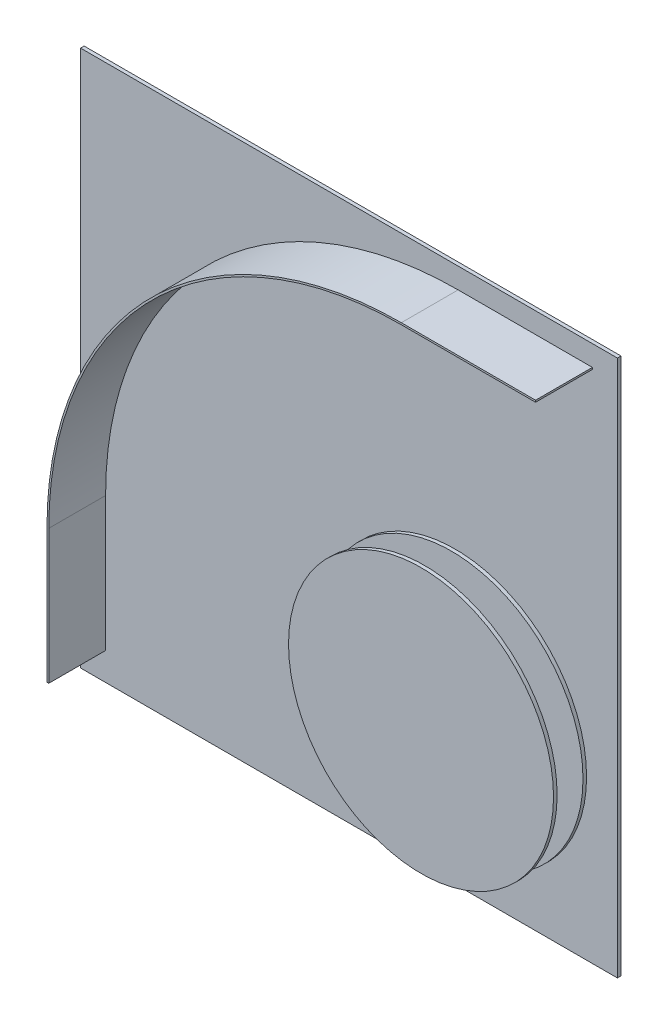
ISO-10303-21;
HEADER;
FILE_DESCRIPTION(('STEP AP214'),'2;1');
FILE_NAME('part.step','',(''),(''),'','','');
FILE_SCHEMA(('AUTOMOTIVE_DESIGN { 1 0 10303 214 1 1 1 1 }'));
ENDSEC;
DATA;
#1=APPLICATION_CONTEXT('core data for automotive mechanical design processes');
#2=APPLICATION_PROTOCOL_DEFINITION('international standard','automotive_design',2000,#1);
#3=PRODUCT_CONTEXT('',#1,'mechanical');
#4=PRODUCT('Part','Part','',(#3));
#5=PRODUCT_RELATED_PRODUCT_CATEGORY('part','',(#4));
#6=PRODUCT_DEFINITION_FORMATION('','',#4);
#7=PRODUCT_DEFINITION_CONTEXT('part definition',#1,'design');
#8=PRODUCT_DEFINITION('design','',#6,#7);
#9=PRODUCT_DEFINITION_SHAPE('','',#8);
#10=(LENGTH_UNIT() NAMED_UNIT(*) SI_UNIT(.MILLI.,.METRE.));
#11=(NAMED_UNIT(*) PLANE_ANGLE_UNIT() SI_UNIT($,.RADIAN.));
#12=(NAMED_UNIT(*) SI_UNIT($,.STERADIAN.) SOLID_ANGLE_UNIT());
#13=UNCERTAINTY_MEASURE_WITH_UNIT(LENGTH_MEASURE(1.E-05),#10,'distance_accuracy_value','');
#14=(GEOMETRIC_REPRESENTATION_CONTEXT(3) GLOBAL_UNCERTAINTY_ASSIGNED_CONTEXT((#13)) GLOBAL_UNIT_ASSIGNED_CONTEXT((#10,
#11,#12)) REPRESENTATION_CONTEXT('',''));
#15=CARTESIAN_POINT('',(0.,0.,0.));
#16=DIRECTION('',(0.,0.,1.));
#17=DIRECTION('',(1.,0.,0.));
#18=AXIS2_PLACEMENT_3D('',#15,#16,#17);
#19=CARTESIAN_POINT('',(-422.012002147075,419.033794954374,-7.5));
#20=DIRECTION('',(-1.,0.,0.));
#21=DIRECTION('',(0.,-1.,0.));
#22=AXIS2_PLACEMENT_3D('',#19,#20,#21);
#23=PLANE('',#22);
#24=DIRECTION('',(0.,-1.,0.));
#25=VECTOR('',#24,1.);
#26=CARTESIAN_POINT('',(-422.012002147075,419.033794954374,-3.5));
#27=LINE('',#26,#25);
#28=CARTESIAN_POINT('',(-422.012002147075,419.033794954374,-3.5));
#29=VERTEX_POINT('',#28);
#30=CARTESIAN_POINT('',(-422.012002147075,-180.966205045625,-3.5));
#31=VERTEX_POINT('',#30);
#32=EDGE_CURVE('E116',#29,#31,#27,.T.);
#33=ORIENTED_EDGE('',*,*,#32,.F.);
#34=DIRECTION('',(0.,0.,1.));
#35=VECTOR('',#34,1.);
#36=CARTESIAN_POINT('',(-422.012002147075,419.033794954374,-7.5));
#37=LINE('',#36,#35);
#38=CARTESIAN_POINT('',(-422.012002147075,419.033794954374,-7.5));
#39=VERTEX_POINT('',#38);
#40=EDGE_CURVE('E12',#39,#29,#37,.T.);
#41=ORIENTED_EDGE('',*,*,#40,.F.);
#42=DIRECTION('',(0.,-1.,0.));
#43=VECTOR('',#42,1.);
#44=CARTESIAN_POINT('',(-422.012002147075,419.033794954374,-7.5));
#45=LINE('',#44,#43);
#46=CARTESIAN_POINT('',(-422.012002147075,-180.966205045625,-7.5));
#47=VERTEX_POINT('',#46);
#48=EDGE_CURVE('E110',#39,#47,#45,.T.);
#49=ORIENTED_EDGE('',*,*,#48,.T.);
#50=DIRECTION('',(0.,0.,1.));
#51=VECTOR('',#50,1.);
#52=CARTESIAN_POINT('',(-422.012002147075,-180.966205045625,-7.5));
#53=LINE('',#52,#51);
#54=EDGE_CURVE('E55',#47,#31,#53,.T.);
#55=ORIENTED_EDGE('',*,*,#54,.T.);
#56=EDGE_LOOP('',(#33,#41,#49,#55));
#57=FACE_BOUND('',#56,.T.);
#58=ADVANCED_FACE('F52',(#57),#23,.T.);
#59=CARTESIAN_POINT('',(-422.012002147075,419.033794954374,-7.5));
#60=DIRECTION('',(0.,1.,0.));
#61=DIRECTION('',(0.,0.,1.));
#62=AXIS2_PLACEMENT_3D('',#59,#60,#61);
#63=PLANE('',#62);
#64=DIRECTION('',(-1.,0.,0.));
#65=VECTOR('',#64,1.);
#66=CARTESIAN_POINT('',(-422.012002147075,419.033794954374,-3.5));
#67=LINE('',#66,#65);
#68=CARTESIAN_POINT('',(177.987997852925,419.033794954374,-3.5));
#69=VERTEX_POINT('',#68);
#70=EDGE_CURVE('E112',#69,#29,#67,.T.);
#71=ORIENTED_EDGE('',*,*,#70,.F.);
#72=DIRECTION('',(0.,0.,1.));
#73=VECTOR('',#72,1.);
#74=CARTESIAN_POINT('',(177.987997852925,419.033794954374,-7.5));
#75=LINE('',#74,#73);
#76=CARTESIAN_POINT('',(177.987997852925,419.033794954374,-7.5));
#77=VERTEX_POINT('',#76);
#78=EDGE_CURVE('E61',#77,#69,#75,.T.);
#79=ORIENTED_EDGE('',*,*,#78,.F.);
#80=DIRECTION('',(-1.,0.,0.));
#81=VECTOR('',#80,1.);
#82=CARTESIAN_POINT('',(-422.012002147075,419.033794954374,-7.5));
#83=LINE('',#82,#81);
#84=EDGE_CURVE('E107',#77,#39,#83,.T.);
#85=ORIENTED_EDGE('',*,*,#84,.T.);
#86=ORIENTED_EDGE('',*,*,#40,.T.);
#87=EDGE_LOOP('',(#71,#79,#85,#86));
#88=FACE_BOUND('',#87,.T.);
#89=ADVANCED_FACE('F126',(#88),#63,.T.);
#90=CARTESIAN_POINT('',(177.987997852925,419.033794954374,-7.5));
#91=DIRECTION('',(1.,0.,0.));
#92=DIRECTION('',(0.,1.,0.));
#93=AXIS2_PLACEMENT_3D('',#90,#91,#92);
#94=PLANE('',#93);
#95=DIRECTION('',(0.,1.,0.));
#96=VECTOR('',#95,1.);
#97=CARTESIAN_POINT('',(177.987997852925,419.033794954374,-3.5));
#98=LINE('',#97,#96);
#99=CARTESIAN_POINT('',(177.987997852925,-180.966205045625,-3.5));
#100=VERTEX_POINT('',#99);
#101=EDGE_CURVE('E102',#100,#69,#98,.T.);
#102=ORIENTED_EDGE('',*,*,#101,.F.);
#103=DIRECTION('',(0.,0.,1.));
#104=VECTOR('',#103,1.);
#105=CARTESIAN_POINT('',(177.987997852925,-180.966205045625,-7.5));
#106=LINE('',#105,#104);
#107=CARTESIAN_POINT('',(177.987997852925,-180.966205045625,-7.5));
#108=VERTEX_POINT('',#107);
#109=EDGE_CURVE('E97',#108,#100,#106,.T.);
#110=ORIENTED_EDGE('',*,*,#109,.F.);
#111=DIRECTION('',(0.,1.,0.));
#112=VECTOR('',#111,1.);
#113=CARTESIAN_POINT('',(177.987997852925,419.033794954374,-7.5));
#114=LINE('',#113,#112);
#115=EDGE_CURVE('E100',#108,#77,#114,.T.);
#116=ORIENTED_EDGE('',*,*,#115,.T.);
#117=ORIENTED_EDGE('',*,*,#78,.T.);
#118=EDGE_LOOP('',(#102,#110,#116,#117));
#119=FACE_BOUND('',#118,.T.);
#120=ADVANCED_FACE('F99',(#119),#94,.T.);
#121=CARTESIAN_POINT('',(-422.012002147075,-180.966205045625,-7.5));
#122=DIRECTION('',(0.,-1.,0.));
#123=DIRECTION('',(0.,0.,-1.));
#124=AXIS2_PLACEMENT_3D('',#121,#122,#123);
#125=PLANE('',#124);
#126=DIRECTION('',(1.,0.,0.));
#127=VECTOR('',#126,1.);
#128=CARTESIAN_POINT('',(-422.012002147075,-180.966205045625,-3.5));
#129=LINE('',#128,#127);
#130=EDGE_CURVE('E119',#31,#100,#129,.T.);
#131=ORIENTED_EDGE('',*,*,#130,.F.);
#132=ORIENTED_EDGE('',*,*,#54,.F.);
#133=DIRECTION('',(1.,0.,0.));
#134=VECTOR('',#133,1.);
#135=CARTESIAN_POINT('',(-422.012002147075,-180.966205045625,-7.5));
#136=LINE('',#135,#134);
#137=EDGE_CURVE('E106',#47,#108,#136,.T.);
#138=ORIENTED_EDGE('',*,*,#137,.T.);
#139=ORIENTED_EDGE('',*,*,#109,.T.);
#140=EDGE_LOOP('',(#131,#132,#138,#139));
#141=FACE_BOUND('',#140,.T.);
#142=ADVANCED_FACE('F109',(#141),#125,.T.);
#143=CARTESIAN_POINT('',(0.,0.,-7.5));
#144=DIRECTION('',(0.,0.,1.));
#145=DIRECTION('',(1.,0.,0.));
#146=AXIS2_PLACEMENT_3D('',#143,#144,#145);
#147=PLANE('',#146);
#148=ORIENTED_EDGE('',*,*,#48,.F.);
#149=ORIENTED_EDGE('',*,*,#84,.F.);
#150=ORIENTED_EDGE('',*,*,#115,.F.);
#151=ORIENTED_EDGE('',*,*,#137,.F.);
#152=EDGE_LOOP('',(#148,#149,#150,#151));
#153=FACE_BOUND('',#152,.T.);
#154=ADVANCED_FACE('F105',(#153),#147,.F.);
#155=CARTESIAN_POINT('',(0.,0.,-3.5));
#156=DIRECTION('',(0.,0.,1.));
#157=DIRECTION('',(1.,0.,0.));
#158=AXIS2_PLACEMENT_3D('',#155,#156,#157);
#159=PLANE('',#158);
#160=ORIENTED_EDGE('',*,*,#32,.T.);
#161=ORIENTED_EDGE('',*,*,#130,.T.);
#162=ORIENTED_EDGE('',*,*,#101,.T.);
#163=ORIENTED_EDGE('',*,*,#70,.T.);
#164=EDGE_LOOP('',(#160,#161,#162,#163));
#165=FACE_BOUND('',#164,.T.);
#166=ADVANCED_FACE('F125',(#165),#159,.T.);
#167=CLOSED_SHELL('',(#58,#89,#120,#142,#154,#166));
#168=MANIFOLD_SOLID_BREP('B2',#167);
#169=CARTESIAN_POINT('',(0.,0.,38.));
#170=DIRECTION('',(0.,0.,-1.));
#171=DIRECTION('',(-1.,0.,0.));
#172=AXIS2_PLACEMENT_3D('',#169,#170,#171);
#173=CYLINDRICAL_SURFACE('',#172,148.070981451019);
#174=CARTESIAN_POINT('',(0.,0.,38.));
#175=DIRECTION('',(0.,0.,1.));
#176=DIRECTION('',(1.,0.,0.));
#177=AXIS2_PLACEMENT_3D('',#174,#175,#176);
#178=CIRCLE('',#177,148.070981451019);
#179=CARTESIAN_POINT('',(148.070981451019,0.,38.));
#180=VERTEX_POINT('',#179);
#181=EDGE_CURVE('E51',#180,#180,#178,.T.);
#182=ORIENTED_EDGE('',*,*,#181,.F.);
#183=EDGE_LOOP('',(#182));
#184=FACE_BOUND('',#183,.T.);
#185=CARTESIAN_POINT('',(0.,0.,34.));
#186=DIRECTION('',(0.,0.,1.));
#187=DIRECTION('',(1.,0.,0.));
#188=AXIS2_PLACEMENT_3D('',#185,#186,#187);
#189=CIRCLE('',#188,148.070981451019);
#190=CARTESIAN_POINT('',(148.070981451019,0.,34.));
#191=VERTEX_POINT('',#190);
#192=EDGE_CURVE('E195',#191,#191,#189,.T.);
#193=ORIENTED_EDGE('',*,*,#192,.T.);
#194=EDGE_LOOP('',(#193));
#195=FACE_BOUND('',#194,.T.);
#196=ADVANCED_FACE('F192',(#184,#195),#173,.T.);
#197=CARTESIAN_POINT('',(0.,0.,38.));
#198=DIRECTION('',(0.,0.,1.));
#199=DIRECTION('',(1.,0.,0.));
#200=AXIS2_PLACEMENT_3D('',#197,#198,#199);
#201=PLANE('',#200);
#202=ORIENTED_EDGE('',*,*,#181,.T.);
#203=EDGE_LOOP('',(#202));
#204=FACE_BOUND('',#203,.T.);
#205=ADVANCED_FACE('F207',(#204),#201,.T.);
#206=CARTESIAN_POINT('',(0.,0.,34.));
#207=DIRECTION('',(0.,0.,1.));
#208=DIRECTION('',(1.,0.,0.));
#209=AXIS2_PLACEMENT_3D('',#206,#207,#208);
#210=PLANE('',#209);
#211=ORIENTED_EDGE('',*,*,#192,.F.);
#212=EDGE_LOOP('',(#211));
#213=FACE_BOUND('',#212,.T.);
#214=ADVANCED_FACE('F205',(#213),#210,.F.);
#215=CLOSED_SHELL('',(#196,#205,#214));
#216=MANIFOLD_SOLID_BREP('B6',#215);
#217=CARTESIAN_POINT('',(0.,394.,-5.5));
#218=DIRECTION('',(0.,-1.,0.));
#219=DIRECTION('',(0.,0.,-1.));
#220=AXIS2_PLACEMENT_3D('',#217,#218,#219);
#221=PLANE('',#220);
#222=DIRECTION('',(0.,0.,1.));
#223=VECTOR('',#222,1.);
#224=CARTESIAN_POINT('',(150.,394.,-5.5));
#225=LINE('',#224,#223);
#226=CARTESIAN_POINT('',(150.,394.,-5.5));
#227=VERTEX_POINT('',#226);
#228=CARTESIAN_POINT('',(150.,394.,60.));
#229=VERTEX_POINT('',#228);
#230=EDGE_CURVE('E245',#227,#229,#225,.T.);
#231=ORIENTED_EDGE('',*,*,#230,.T.);
#232=DIRECTION('',(1.,0.,0.));
#233=VECTOR('',#232,1.);
#234=CARTESIAN_POINT('',(0.,394.,60.));
#235=LINE('',#234,#233);
#236=CARTESIAN_POINT('',(0.,394.,60.));
#237=VERTEX_POINT('',#236);
#238=EDGE_CURVE('E306',#237,#229,#235,.T.);
#239=ORIENTED_EDGE('',*,*,#238,.F.);
#240=DIRECTION('',(0.,0.,1.));
#241=VECTOR('',#240,1.);
#242=CARTESIAN_POINT('',(0.,394.,-5.5));
#243=LINE('',#242,#241);
#244=CARTESIAN_POINT('',(0.,394.,-5.5));
#245=VERTEX_POINT('',#244);
#246=EDGE_CURVE('E190',#245,#237,#243,.T.);
#247=ORIENTED_EDGE('',*,*,#246,.F.);
#248=DIRECTION('',(1.,0.,0.));
#249=VECTOR('',#248,1.);
#250=CARTESIAN_POINT('',(0.,394.,-5.5));
#251=LINE('',#250,#249);
#252=EDGE_CURVE('E307',#245,#227,#251,.T.);
#253=ORIENTED_EDGE('',*,*,#252,.T.);
#254=EDGE_LOOP('',(#231,#239,#247,#253));
#255=FACE_BOUND('',#254,.T.);
#256=ADVANCED_FACE('F242',(#255),#221,.T.);
#257=CARTESIAN_POINT('',(0.,0.,-5.5));
#258=DIRECTION('',(0.,0.,1.));
#259=DIRECTION('',(1.,0.,0.));
#260=AXIS2_PLACEMENT_3D('',#257,#258,#259);
#261=CYLINDRICAL_SURFACE('',#260,394.);
#262=ORIENTED_EDGE('',*,*,#246,.T.);
#263=CARTESIAN_POINT('',(0.,0.,60.));
#264=DIRECTION('',(0.,0.,-1.));
#265=DIRECTION('',(-1.,0.,0.));
#266=AXIS2_PLACEMENT_3D('',#263,#264,#265);
#267=CIRCLE('',#266,394.);
#268=CARTESIAN_POINT('',(-394.,0.,60.));
#269=VERTEX_POINT('',#268);
#270=EDGE_CURVE('E321',#269,#237,#267,.T.);
#271=ORIENTED_EDGE('',*,*,#270,.F.);
#272=DIRECTION('',(0.,0.,1.));
#273=VECTOR('',#272,1.);
#274=CARTESIAN_POINT('',(-394.,0.,-5.5));
#275=LINE('',#274,#273);
#276=CARTESIAN_POINT('',(-394.,0.,-5.5));
#277=VERTEX_POINT('',#276);
#278=EDGE_CURVE('E250',#277,#269,#275,.T.);
#279=ORIENTED_EDGE('',*,*,#278,.F.);
#280=CARTESIAN_POINT('',(0.,0.,-5.5));
#281=DIRECTION('',(0.,0.,-1.));
#282=DIRECTION('',(-1.,0.,0.));
#283=AXIS2_PLACEMENT_3D('',#280,#281,#282);
#284=CIRCLE('',#283,394.);
#285=EDGE_CURVE('E312',#277,#245,#284,.T.);
#286=ORIENTED_EDGE('',*,*,#285,.T.);
#287=EDGE_LOOP('',(#262,#271,#279,#286));
#288=FACE_BOUND('',#287,.T.);
#289=ADVANCED_FACE('F385',(#288),#261,.F.);
#290=CARTESIAN_POINT('',(-394.,0.,-5.5));
#291=DIRECTION('',(1.,0.,0.));
#292=DIRECTION('',(0.,0.,-1.));
#293=AXIS2_PLACEMENT_3D('',#290,#291,#292);
#294=PLANE('',#293);
#295=ORIENTED_EDGE('',*,*,#278,.T.);
#296=DIRECTION('',(0.,1.,0.));
#297=VECTOR('',#296,1.);
#298=CARTESIAN_POINT('',(-394.,0.,60.));
#299=LINE('',#298,#297);
#300=CARTESIAN_POINT('',(-394.,-150.,60.));
#301=VERTEX_POINT('',#300);
#302=EDGE_CURVE('E338',#301,#269,#299,.T.);
#303=ORIENTED_EDGE('',*,*,#302,.F.);
#304=DIRECTION('',(0.,0.,1.));
#305=VECTOR('',#304,1.);
#306=CARTESIAN_POINT('',(-394.,-150.,-5.5));
#307=LINE('',#306,#305);
#308=CARTESIAN_POINT('',(-394.,-150.,-5.5));
#309=VERTEX_POINT('',#308);
#310=EDGE_CURVE('E356',#309,#301,#307,.T.);
#311=ORIENTED_EDGE('',*,*,#310,.F.);
#312=DIRECTION('',(0.,1.,0.));
#313=VECTOR('',#312,1.);
#314=CARTESIAN_POINT('',(-394.,0.,-5.5));
#315=LINE('',#314,#313);
#316=EDGE_CURVE('E352',#309,#277,#315,.T.);
#317=ORIENTED_EDGE('',*,*,#316,.T.);
#318=EDGE_LOOP('',(#295,#303,#311,#317));
#319=FACE_BOUND('',#318,.T.);
#320=ADVANCED_FACE('F384',(#319),#294,.T.);
#321=CARTESIAN_POINT('',(-394.,-150.,-5.5));
#322=DIRECTION('',(0.,1.,0.));
#323=DIRECTION('',(0.,0.,1.));
#324=AXIS2_PLACEMENT_3D('',#321,#322,#323);
#325=PLANE('',#324);
#326=ORIENTED_EDGE('',*,*,#310,.T.);
#327=DIRECTION('',(-1.,0.,0.));
#328=VECTOR('',#327,1.);
#329=CARTESIAN_POINT('',(-394.,-150.,60.));
#330=LINE('',#329,#328);
#331=CARTESIAN_POINT('',(-396.,-150.,60.));
#332=VERTEX_POINT('',#331);
#333=EDGE_CURVE('E335',#301,#332,#330,.T.);
#334=ORIENTED_EDGE('',*,*,#333,.T.);
#335=DIRECTION('',(0.,0.,1.));
#336=VECTOR('',#335,1.);
#337=CARTESIAN_POINT('',(-396.,-150.,-5.5));
#338=LINE('',#337,#336);
#339=CARTESIAN_POINT('',(-396.,-150.,-5.5));
#340=VERTEX_POINT('',#339);
#341=EDGE_CURVE('E358',#340,#332,#338,.T.);
#342=ORIENTED_EDGE('',*,*,#341,.F.);
#343=DIRECTION('',(-1.,0.,0.));
#344=VECTOR('',#343,1.);
#345=CARTESIAN_POINT('',(-394.,-150.,-5.5));
#346=LINE('',#345,#344);
#347=EDGE_CURVE('E350',#309,#340,#346,.T.);
#348=ORIENTED_EDGE('',*,*,#347,.F.);
#349=EDGE_LOOP('',(#326,#334,#342,#348));
#350=FACE_BOUND('',#349,.T.);
#351=ADVANCED_FACE('F379',(#350),#325,.F.);
#352=CARTESIAN_POINT('',(-396.,0.,-5.5));
#353=DIRECTION('',(1.,0.,0.));
#354=DIRECTION('',(0.,0.,-1.));
#355=AXIS2_PLACEMENT_3D('',#352,#353,#354);
#356=PLANE('',#355);
#357=ORIENTED_EDGE('',*,*,#341,.T.);
#358=DIRECTION('',(0.,1.,0.));
#359=VECTOR('',#358,1.);
#360=CARTESIAN_POINT('',(-396.,0.,60.));
#361=LINE('',#360,#359);
#362=CARTESIAN_POINT('',(-396.,0.,60.));
#363=VERTEX_POINT('',#362);
#364=EDGE_CURVE('E332',#332,#363,#361,.T.);
#365=ORIENTED_EDGE('',*,*,#364,.T.);
#366=DIRECTION('',(0.,0.,1.));
#367=VECTOR('',#366,1.);
#368=CARTESIAN_POINT('',(-396.,0.,-5.5));
#369=LINE('',#368,#367);
#370=CARTESIAN_POINT('',(-396.,0.,-5.5));
#371=VERTEX_POINT('',#370);
#372=EDGE_CURVE('E360',#371,#363,#369,.T.);
#373=ORIENTED_EDGE('',*,*,#372,.F.);
#374=DIRECTION('',(0.,1.,0.));
#375=VECTOR('',#374,1.);
#376=CARTESIAN_POINT('',(-396.,0.,-5.5));
#377=LINE('',#376,#375);
#378=EDGE_CURVE('E348',#340,#371,#377,.T.);
#379=ORIENTED_EDGE('',*,*,#378,.F.);
#380=EDGE_LOOP('',(#357,#365,#373,#379));
#381=FACE_BOUND('',#380,.T.);
#382=ADVANCED_FACE('F375',(#381),#356,.F.);
#383=CARTESIAN_POINT('',(0.,0.,-5.5));
#384=DIRECTION('',(0.,0.,1.));
#385=DIRECTION('',(1.,0.,0.));
#386=AXIS2_PLACEMENT_3D('',#383,#384,#385);
#387=CYLINDRICAL_SURFACE('',#386,396.);
#388=ORIENTED_EDGE('',*,*,#372,.T.);
#389=CARTESIAN_POINT('',(0.,0.,60.));
#390=DIRECTION('',(0.,0.,1.));
#391=DIRECTION('',(1.,0.,0.));
#392=AXIS2_PLACEMENT_3D('',#389,#390,#391);
#393=CIRCLE('',#392,396.);
#394=CARTESIAN_POINT('',(0.,396.,60.));
#395=VERTEX_POINT('',#394);
#396=EDGE_CURVE('E327',#363,#395,#393,.F.);
#397=ORIENTED_EDGE('',*,*,#396,.T.);
#398=DIRECTION('',(0.,0.,1.));
#399=VECTOR('',#398,1.);
#400=CARTESIAN_POINT('',(0.,396.,-5.5));
#401=LINE('',#400,#399);
#402=CARTESIAN_POINT('',(0.,396.,-5.5));
#403=VERTEX_POINT('',#402);
#404=EDGE_CURVE('E362',#403,#395,#401,.T.);
#405=ORIENTED_EDGE('',*,*,#404,.F.);
#406=CARTESIAN_POINT('',(0.,0.,-5.5));
#407=DIRECTION('',(0.,0.,1.));
#408=DIRECTION('',(1.,0.,0.));
#409=AXIS2_PLACEMENT_3D('',#406,#407,#408);
#410=CIRCLE('',#409,396.);
#411=EDGE_CURVE('E346',#371,#403,#410,.F.);
#412=ORIENTED_EDGE('',*,*,#411,.F.);
#413=EDGE_LOOP('',(#388,#397,#405,#412));
#414=FACE_BOUND('',#413,.T.);
#415=ADVANCED_FACE('F371',(#414),#387,.T.);
#416=CARTESIAN_POINT('',(0.,396.,-5.5));
#417=DIRECTION('',(0.,-1.,0.));
#418=DIRECTION('',(0.,0.,-1.));
#419=AXIS2_PLACEMENT_3D('',#416,#417,#418);
#420=PLANE('',#419);
#421=ORIENTED_EDGE('',*,*,#404,.T.);
#422=DIRECTION('',(1.,0.,0.));
#423=VECTOR('',#422,1.);
#424=CARTESIAN_POINT('',(0.,396.,60.));
#425=LINE('',#424,#423);
#426=CARTESIAN_POINT('',(150.,396.,60.));
#427=VERTEX_POINT('',#426);
#428=EDGE_CURVE('E325',#395,#427,#425,.T.);
#429=ORIENTED_EDGE('',*,*,#428,.T.);
#430=DIRECTION('',(0.,0.,1.));
#431=VECTOR('',#430,1.);
#432=CARTESIAN_POINT('',(150.,396.,-5.5));
#433=LINE('',#432,#431);
#434=CARTESIAN_POINT('',(150.,396.,-5.5));
#435=VERTEX_POINT('',#434);
#436=EDGE_CURVE('E311',#435,#427,#433,.T.);
#437=ORIENTED_EDGE('',*,*,#436,.F.);
#438=DIRECTION('',(1.,0.,0.));
#439=VECTOR('',#438,1.);
#440=CARTESIAN_POINT('',(0.,396.,-5.5));
#441=LINE('',#440,#439);
#442=EDGE_CURVE('E344',#403,#435,#441,.T.);
#443=ORIENTED_EDGE('',*,*,#442,.F.);
#444=EDGE_LOOP('',(#421,#429,#437,#443));
#445=FACE_BOUND('',#444,.T.);
#446=ADVANCED_FACE('F366',(#445),#420,.F.);
#447=CARTESIAN_POINT('',(150.,396.,-5.5));
#448=DIRECTION('',(-1.,0.,0.));
#449=DIRECTION('',(0.,0.,1.));
#450=AXIS2_PLACEMENT_3D('',#447,#448,#449);
#451=PLANE('',#450);
#452=ORIENTED_EDGE('',*,*,#436,.T.);
#453=DIRECTION('',(0.,-1.,0.));
#454=VECTOR('',#453,1.);
#455=CARTESIAN_POINT('',(150.,396.,60.));
#456=LINE('',#455,#454);
#457=EDGE_CURVE('E318',#427,#229,#456,.T.);
#458=ORIENTED_EDGE('',*,*,#457,.T.);
#459=ORIENTED_EDGE('',*,*,#230,.F.);
#460=DIRECTION('',(0.,-1.,0.));
#461=VECTOR('',#460,1.);
#462=CARTESIAN_POINT('',(150.,396.,-5.5));
#463=LINE('',#462,#461);
#464=EDGE_CURVE('E342',#435,#227,#463,.T.);
#465=ORIENTED_EDGE('',*,*,#464,.F.);
#466=EDGE_LOOP('',(#452,#458,#459,#465));
#467=FACE_BOUND('',#466,.T.);
#468=ADVANCED_FACE('F323',(#467),#451,.F.);
#469=CARTESIAN_POINT('',(0.,0.,-5.5));
#470=DIRECTION('',(0.,0.,1.));
#471=DIRECTION('',(1.,0.,0.));
#472=AXIS2_PLACEMENT_3D('',#469,#470,#471);
#473=PLANE('',#472);
#474=ORIENTED_EDGE('',*,*,#252,.F.);
#475=ORIENTED_EDGE('',*,*,#285,.F.);
#476=ORIENTED_EDGE('',*,*,#316,.F.);
#477=ORIENTED_EDGE('',*,*,#347,.T.);
#478=ORIENTED_EDGE('',*,*,#378,.T.);
#479=ORIENTED_EDGE('',*,*,#411,.T.);
#480=ORIENTED_EDGE('',*,*,#442,.T.);
#481=ORIENTED_EDGE('',*,*,#464,.T.);
#482=EDGE_LOOP('',(#474,#475,#476,#477,#478,#479,#480,#481));
#483=FACE_BOUND('',#482,.T.);
#484=ADVANCED_FACE('F388',(#483),#473,.F.);
#485=CARTESIAN_POINT('',(0.,0.,60.));
#486=DIRECTION('',(0.,0.,1.));
#487=DIRECTION('',(1.,0.,0.));
#488=AXIS2_PLACEMENT_3D('',#485,#486,#487);
#489=PLANE('',#488);
#490=ORIENTED_EDGE('',*,*,#238,.T.);
#491=ORIENTED_EDGE('',*,*,#457,.F.);
#492=ORIENTED_EDGE('',*,*,#428,.F.);
#493=ORIENTED_EDGE('',*,*,#396,.F.);
#494=ORIENTED_EDGE('',*,*,#364,.F.);
#495=ORIENTED_EDGE('',*,*,#333,.F.);
#496=ORIENTED_EDGE('',*,*,#302,.T.);
#497=ORIENTED_EDGE('',*,*,#270,.T.);
#498=EDGE_LOOP('',(#490,#491,#492,#493,#494,#495,#496,#497));
#499=FACE_BOUND('',#498,.T.);
#500=ADVANCED_FACE('F316',(#499),#489,.T.);
#501=CLOSED_SHELL('',(#256,#289,#320,#351,#382,#415,#446,#468,#484,#500));
#502=MANIFOLD_SOLID_BREP('B46',#501);
#503=CARTESIAN_POINT('',(0.,0.,4.));
#504=DIRECTION('',(0.,0.,1.));
#505=DIRECTION('',(1.,0.,0.));
#506=AXIS2_PLACEMENT_3D('',#503,#504,#505);
#507=PLANE('',#506);
#508=CARTESIAN_POINT('',(4.78519013873213E-12,-84.5462516919184,4.));
#509=DIRECTION('',(0.,0.,1.));
#510=DIRECTION('',(1.,0.,0.));
#511=AXIS2_PLACEMENT_3D('',#508,#509,#510);
#512=CIRCLE('',#511,15.0000000000051);
#513=CARTESIAN_POINT('',(15.0000000000099,-84.5462516919184,4.));
#514=VERTEX_POINT('',#513);
#515=EDGE_CURVE('E501',#514,#514,#512,.T.);
#516=ORIENTED_EDGE('',*,*,#515,.F.);
#517=EDGE_LOOP('',(#516));
#518=FACE_BOUND('',#517,.T.);
#519=CARTESIAN_POINT('',(0.,84.5462516919184,4.));
#520=DIRECTION('',(0.,0.,1.));
#521=DIRECTION('',(1.,0.,0.));
#522=AXIS2_PLACEMENT_3D('',#519,#520,#521);
#523=CIRCLE('',#522,15.);
#524=CARTESIAN_POINT('',(15.,84.5462516919184,4.));
#525=VERTEX_POINT('',#524);
#526=EDGE_CURVE('E489',#525,#525,#523,.T.);
#527=ORIENTED_EDGE('',*,*,#526,.F.);
#528=EDGE_LOOP('',(#527));
#529=FACE_BOUND('',#528,.T.);
#530=CARTESIAN_POINT('',(0.,0.,4.));
#531=DIRECTION('',(0.,0.,1.));
#532=DIRECTION('',(1.,0.,0.));
#533=AXIS2_PLACEMENT_3D('',#530,#531,#532);
#534=CIRCLE('',#533,147.);
#535=CARTESIAN_POINT('',(147.,0.,4.));
#536=VERTEX_POINT('',#535);
#537=EDGE_CURVE('E241',#536,#536,#534,.T.);
#538=ORIENTED_EDGE('',*,*,#537,.T.);
#539=EDGE_LOOP('',(#538));
#540=FACE_BOUND('',#539,.T.);
#541=CARTESIAN_POINT('',(84.5462516919208,2.39259506936607E-12,4.));
#542=DIRECTION('',(0.,0.,1.));
#543=DIRECTION('',(1.,0.,0.));
#544=AXIS2_PLACEMENT_3D('',#541,#542,#543);
#545=CIRCLE('',#544,15.0000000000019);
#546=CARTESIAN_POINT('',(99.5462516919227,2.39259506936607E-12,4.));
#547=VERTEX_POINT('',#546);
#548=EDGE_CURVE('E495',#547,#547,#545,.T.);
#549=ORIENTED_EDGE('',*,*,#548,.F.);
#550=EDGE_LOOP('',(#549));
#551=FACE_BOUND('',#550,.T.);
#552=CARTESIAN_POINT('',(-84.546251691916,-2.40294899901751E-12,4.));
#553=DIRECTION('',(0.,0.,1.));
#554=DIRECTION('',(1.,0.,0.));
#555=AXIS2_PLACEMENT_3D('',#552,#553,#554);
#556=CIRCLE('',#555,15.0000000000038);
#557=CARTESIAN_POINT('',(-69.5462516919122,-2.40294899901751E-12,4.));
#558=VERTEX_POINT('',#557);
#559=EDGE_CURVE('E507',#558,#558,#556,.T.);
#560=ORIENTED_EDGE('',*,*,#559,.F.);
#561=EDGE_LOOP('',(#560));
#562=FACE_BOUND('',#561,.T.);
#563=ADVANCED_FACE('F476',(#518,#529,#540,#551,#562),#507,.T.);
#564=CARTESIAN_POINT('',(0.,0.,4.));
#565=DIRECTION('',(0.,0.,-1.));
#566=DIRECTION('',(-1.,0.,0.));
#567=AXIS2_PLACEMENT_3D('',#564,#565,#566);
#568=CYLINDRICAL_SURFACE('',#567,147.);
#569=ORIENTED_EDGE('',*,*,#537,.F.);
#570=EDGE_LOOP('',(#569));
#571=FACE_BOUND('',#570,.T.);
#572=CARTESIAN_POINT('',(0.,0.,0.));
#573=DIRECTION('',(0.,0.,1.));
#574=DIRECTION('',(1.,0.,0.));
#575=AXIS2_PLACEMENT_3D('',#572,#573,#574);
#576=CIRCLE('',#575,147.);
#577=CARTESIAN_POINT('',(147.,0.,0.));
#578=VERTEX_POINT('',#577);
#579=EDGE_CURVE('E480',#578,#578,#576,.T.);
#580=ORIENTED_EDGE('',*,*,#579,.T.);
#581=EDGE_LOOP('',(#580));
#582=FACE_BOUND('',#581,.T.);
#583=ADVANCED_FACE('F478',(#571,#582),#568,.T.);
#584=CARTESIAN_POINT('',(0.,0.,0.));
#585=DIRECTION('',(0.,0.,1.));
#586=DIRECTION('',(1.,0.,0.));
#587=AXIS2_PLACEMENT_3D('',#584,#585,#586);
#588=PLANE('',#587);
#589=ORIENTED_EDGE('',*,*,#579,.F.);
#590=EDGE_LOOP('',(#589));
#591=FACE_BOUND('',#590,.T.);
#592=ADVANCED_FACE('F528',(#591),#588,.F.);
#593=CARTESIAN_POINT('',(0.,84.5462516919184,34.));
#594=DIRECTION('',(0.,0.,-1.));
#595=DIRECTION('',(-1.,0.,0.));
#596=AXIS2_PLACEMENT_3D('',#593,#594,#595);
#597=CYLINDRICAL_SURFACE('',#596,15.);
#598=CARTESIAN_POINT('',(0.,84.5462516919184,34.));
#599=DIRECTION('',(0.,0.,1.));
#600=DIRECTION('',(1.,0.,0.));
#601=AXIS2_PLACEMENT_3D('',#598,#599,#600);
#602=CIRCLE('',#601,15.);
#603=CARTESIAN_POINT('',(15.,84.5462516919184,34.));
#604=VERTEX_POINT('',#603);
#605=EDGE_CURVE('E487',#604,#604,#602,.T.);
#606=ORIENTED_EDGE('',*,*,#605,.F.);
#607=EDGE_LOOP('',(#606));
#608=FACE_BOUND('',#607,.T.);
#609=ORIENTED_EDGE('',*,*,#526,.T.);
#610=EDGE_LOOP('',(#609));
#611=FACE_BOUND('',#610,.T.);
#612=ADVANCED_FACE('F533',(#608,#611),#597,.T.);
#613=CARTESIAN_POINT('',(0.,84.5462516919184,34.));
#614=DIRECTION('',(0.,0.,1.));
#615=DIRECTION('',(1.,0.,0.));
#616=AXIS2_PLACEMENT_3D('',#613,#614,#615);
#617=PLANE('',#616);
#618=ORIENTED_EDGE('',*,*,#605,.T.);
#619=EDGE_LOOP('',(#618));
#620=FACE_BOUND('',#619,.T.);
#621=ADVANCED_FACE('F540',(#620),#617,.T.);
#622=CARTESIAN_POINT('',(84.5462516919208,2.39259506936607E-12,34.));
#623=DIRECTION('',(0.,0.,-1.));
#624=DIRECTION('',(-1.,0.,0.));
#625=AXIS2_PLACEMENT_3D('',#622,#623,#624);
#626=CYLINDRICAL_SURFACE('',#625,15.0000000000019);
#627=CARTESIAN_POINT('',(84.5462516919208,2.39259506936607E-12,34.));
#628=DIRECTION('',(0.,0.,1.));
#629=DIRECTION('',(1.,0.,0.));
#630=AXIS2_PLACEMENT_3D('',#627,#628,#629);
#631=CIRCLE('',#630,15.0000000000019);
#632=CARTESIAN_POINT('',(99.5462516919227,2.39259506936607E-12,34.));
#633=VERTEX_POINT('',#632);
#634=EDGE_CURVE('E492',#633,#633,#631,.T.);
#635=ORIENTED_EDGE('',*,*,#634,.F.);
#636=EDGE_LOOP('',(#635));
#637=FACE_BOUND('',#636,.T.);
#638=ORIENTED_EDGE('',*,*,#548,.T.);
#639=EDGE_LOOP('',(#638));
#640=FACE_BOUND('',#639,.T.);
#641=ADVANCED_FACE('F547',(#637,#640),#626,.T.);
#642=CARTESIAN_POINT('',(84.5462516919208,2.39259506936607E-12,34.));
#643=DIRECTION('',(0.,0.,1.));
#644=DIRECTION('',(1.,0.,0.));
#645=AXIS2_PLACEMENT_3D('',#642,#643,#644);
#646=PLANE('',#645);
#647=ORIENTED_EDGE('',*,*,#634,.T.);
#648=EDGE_LOOP('',(#647));
#649=FACE_BOUND('',#648,.T.);
#650=ADVANCED_FACE('F556',(#649),#646,.T.);
#651=CARTESIAN_POINT('',(4.78519013873213E-12,-84.5462516919184,34.));
#652=DIRECTION('',(0.,0.,-1.));
#653=DIRECTION('',(-1.,0.,0.));
#654=AXIS2_PLACEMENT_3D('',#651,#652,#653);
#655=CYLINDRICAL_SURFACE('',#654,15.0000000000051);
#656=CARTESIAN_POINT('',(4.78519013873213E-12,-84.5462516919184,34.));
#657=DIRECTION('',(0.,0.,1.));
#658=DIRECTION('',(1.,0.,0.));
#659=AXIS2_PLACEMENT_3D('',#656,#657,#658);
#660=CIRCLE('',#659,15.0000000000051);
#661=CARTESIAN_POINT('',(15.0000000000099,-84.5462516919184,34.));
#662=VERTEX_POINT('',#661);
#663=EDGE_CURVE('E498',#662,#662,#660,.T.);
#664=ORIENTED_EDGE('',*,*,#663,.F.);
#665=EDGE_LOOP('',(#664));
#666=FACE_BOUND('',#665,.T.);
#667=ORIENTED_EDGE('',*,*,#515,.T.);
#668=EDGE_LOOP('',(#667));
#669=FACE_BOUND('',#668,.T.);
#670=ADVANCED_FACE('F562',(#666,#669),#655,.T.);
#671=CARTESIAN_POINT('',(4.78519013873213E-12,-84.5462516919184,34.));
#672=DIRECTION('',(0.,0.,1.));
#673=DIRECTION('',(1.,0.,0.));
#674=AXIS2_PLACEMENT_3D('',#671,#672,#673);
#675=PLANE('',#674);
#676=ORIENTED_EDGE('',*,*,#663,.T.);
#677=EDGE_LOOP('',(#676));
#678=FACE_BOUND('',#677,.T.);
#679=ADVANCED_FACE('F518',(#678),#675,.T.);
#680=CARTESIAN_POINT('',(-84.546251691916,-2.40294899901751E-12,34.));
#681=DIRECTION('',(0.,0.,-1.));
#682=DIRECTION('',(-1.,0.,0.));
#683=AXIS2_PLACEMENT_3D('',#680,#681,#682);
#684=CYLINDRICAL_SURFACE('',#683,15.0000000000038);
#685=CARTESIAN_POINT('',(-84.546251691916,-2.40294899901751E-12,34.));
#686=DIRECTION('',(0.,0.,1.));
#687=DIRECTION('',(1.,0.,0.));
#688=AXIS2_PLACEMENT_3D('',#685,#686,#687);
#689=CIRCLE('',#688,15.0000000000038);
#690=CARTESIAN_POINT('',(-69.5462516919122,-2.40294899901751E-12,34.));
#691=VERTEX_POINT('',#690);
#692=EDGE_CURVE('E504',#691,#691,#689,.T.);
#693=ORIENTED_EDGE('',*,*,#692,.F.);
#694=EDGE_LOOP('',(#693));
#695=FACE_BOUND('',#694,.T.);
#696=ORIENTED_EDGE('',*,*,#559,.T.);
#697=EDGE_LOOP('',(#696));
#698=FACE_BOUND('',#697,.T.);
#699=ADVANCED_FACE('F515',(#695,#698),#684,.T.);
#700=CARTESIAN_POINT('',(-84.546251691916,-2.40294899901751E-12,34.));
#701=DIRECTION('',(0.,0.,1.));
#702=DIRECTION('',(1.,0.,0.));
#703=AXIS2_PLACEMENT_3D('',#700,#701,#702);
#704=PLANE('',#703);
#705=ORIENTED_EDGE('',*,*,#692,.T.);
#706=EDGE_LOOP('',(#705));
#707=FACE_BOUND('',#706,.T.);
#708=ADVANCED_FACE('F513',(#707),#704,.T.);
#709=CLOSED_SHELL('',(#563,#583,#592,#612,#621,#641,#650,#670,#679,#699,#708));
#710=MANIFOLD_SOLID_BREP('B184',#709);
#711=ADVANCED_BREP_SHAPE_REPRESENTATION('',(#18,#168,#216,#502,#710),#14);
#712=SHAPE_DEFINITION_REPRESENTATION(#9,#711);
ENDSEC;
END-ISO-10303-21;
